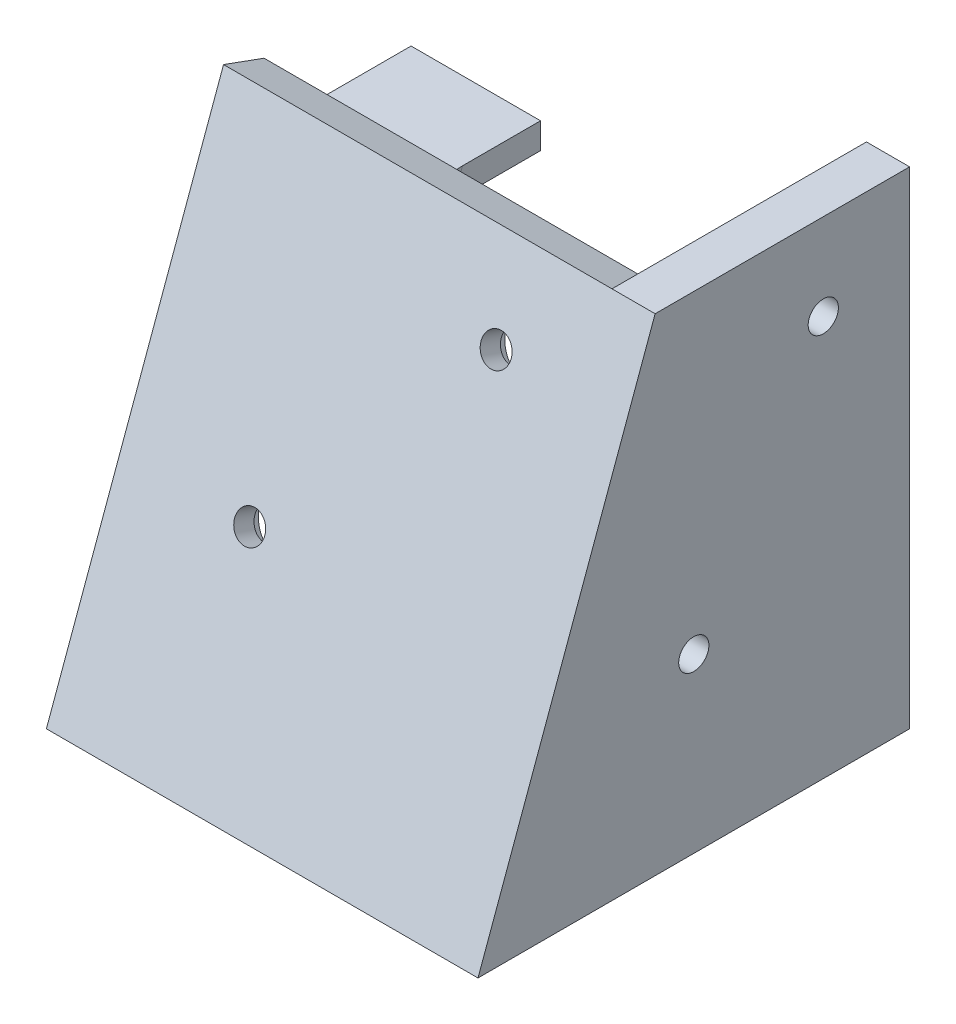
ISO-10303-21;
HEADER;
FILE_DESCRIPTION(('STEP AP214'),'2;1');
FILE_NAME('part.step','',(''),(''),'','','');
FILE_SCHEMA(('AUTOMOTIVE_DESIGN { 1 0 10303 214 1 1 1 1 }'));
ENDSEC;
DATA;
#1=APPLICATION_CONTEXT('core data for automotive mechanical design processes');
#2=APPLICATION_PROTOCOL_DEFINITION('international standard','automotive_design',2000,#1);
#3=PRODUCT_CONTEXT('',#1,'mechanical');
#4=PRODUCT('Part','Part','',(#3));
#5=PRODUCT_RELATED_PRODUCT_CATEGORY('part','',(#4));
#6=PRODUCT_DEFINITION_FORMATION('','',#4);
#7=PRODUCT_DEFINITION_CONTEXT('part definition',#1,'design');
#8=PRODUCT_DEFINITION('design','',#6,#7);
#9=PRODUCT_DEFINITION_SHAPE('','',#8);
#10=(LENGTH_UNIT() NAMED_UNIT(*) SI_UNIT(.MILLI.,.METRE.));
#11=(NAMED_UNIT(*) PLANE_ANGLE_UNIT() SI_UNIT($,.RADIAN.));
#12=(NAMED_UNIT(*) SI_UNIT($,.STERADIAN.) SOLID_ANGLE_UNIT());
#13=UNCERTAINTY_MEASURE_WITH_UNIT(LENGTH_MEASURE(1.E-05),#10,'distance_accuracy_value','');
#14=(GEOMETRIC_REPRESENTATION_CONTEXT(3) GLOBAL_UNCERTAINTY_ASSIGNED_CONTEXT((#13)) GLOBAL_UNIT_ASSIGNED_CONTEXT((#10,
#11,#12)) REPRESENTATION_CONTEXT('',''));
#15=CARTESIAN_POINT('',(0.,0.,0.));
#16=DIRECTION('',(0.,0.,1.));
#17=DIRECTION('',(1.,0.,0.));
#18=AXIS2_PLACEMENT_3D('',#15,#16,#17);
#19=CARTESIAN_POINT('',(25.,54.6714565305261,24.7803282965301));
#20=DIRECTION('',(0.,0.342020143325673,0.939692620785907));
#21=DIRECTION('',(0.,-0.939692620785907,0.342020143325673));
#22=AXIS2_PLACEMENT_3D('',#19,#20,#21);
#23=PLANE('',#22);
#24=CARTESIAN_POINT('',(10.,45.274530322667,28.2005297297869));
#25=DIRECTION('',(0.,-0.342020143325673,-0.939692620785907));
#26=DIRECTION('',(0.,0.939692620785907,-0.342020143325673));
#27=AXIS2_PLACEMENT_3D('',#24,#25,#26);
#28=CIRCLE('',#27,3.49999999999999);
#29=CARTESIAN_POINT('',(10.,48.5634544954177,27.003459228147));
#30=VERTEX_POINT('',#29);
#31=EDGE_CURVE('E207',#30,#30,#28,.T.);
#32=ORIENTED_EDGE('',*,*,#31,.F.);
#33=EDGE_LOOP('',(#32));
#34=FACE_BOUND('',#33,.T.);
#35=DIRECTION('',(0.,0.939692620785907,-0.342020143325673));
#36=VECTOR('',#35,1.);
#37=CARTESIAN_POINT('',(0.,54.6714565305261,24.7803282965301));
#38=LINE('',#37,#36);
#39=CARTESIAN_POINT('',(0.,44.3815572471544,28.5255453492746));
#40=VERTEX_POINT('',#39);
#41=CARTESIAN_POINT('',(0.,47.3815572471544,27.433634646476));
#42=VERTEX_POINT('',#41);
#43=EDGE_CURVE('E332',#40,#42,#38,.T.);
#44=ORIENTED_EDGE('',*,*,#43,.T.);
#45=DIRECTION('',(1.,0.,0.));
#46=VECTOR('',#45,1.);
#47=CARTESIAN_POINT('',(25.,47.3815572471544,27.433634646476));
#48=LINE('',#47,#46);
#49=CARTESIAN_POINT('',(-25.,47.3815572471544,27.433634646476));
#50=VERTEX_POINT('',#49);
#51=EDGE_CURVE('E188',#50,#42,#48,.T.);
#52=ORIENTED_EDGE('',*,*,#51,.F.);
#53=DIRECTION('',(0.,0.939692620785907,-0.342020143325673));
#54=VECTOR('',#53,1.);
#55=CARTESIAN_POINT('',(-25.,54.6714565305261,24.7803282965301));
#56=LINE('',#55,#54);
#57=CARTESIAN_POINT('',(-25.,54.6714565305261,24.7803282965301));
#58=VERTEX_POINT('',#57);
#59=EDGE_CURVE('E307',#50,#58,#56,.T.);
#60=ORIENTED_EDGE('',*,*,#59,.T.);
#61=DIRECTION('',(-1.,0.,0.));
#62=VECTOR('',#61,1.);
#63=CARTESIAN_POINT('',(25.,54.6714565305261,24.7803282965301));
#64=LINE('',#63,#62);
#65=CARTESIAN_POINT('',(20.,54.6714565305261,24.7803282965301));
#66=VERTEX_POINT('',#65);
#67=EDGE_CURVE('E326',#66,#58,#64,.T.);
#68=ORIENTED_EDGE('',*,*,#67,.F.);
#69=DIRECTION('',(0.,0.939692620785907,-0.342020143325673));
#70=VECTOR('',#69,1.);
#71=CARTESIAN_POINT('',(20.,-1.71074350423805,45.3017708516274));
#72=LINE('',#71,#70);
#73=CARTESIAN_POINT('',(20.,5.,42.8592599662894));
#74=VERTEX_POINT('',#73);
#75=EDGE_CURVE('E292',#74,#66,#72,.T.);
#76=ORIENTED_EDGE('',*,*,#75,.F.);
#77=DIRECTION('',(-1.,0.,0.));
#78=VECTOR('',#77,1.);
#79=CARTESIAN_POINT('',(25.,5.,42.8592599662894));
#80=LINE('',#79,#78);
#81=CARTESIAN_POINT('',(-25.,5.,42.8592599662894));
#82=VERTEX_POINT('',#81);
#83=EDGE_CURVE('E329',#74,#82,#80,.T.);
#84=ORIENTED_EDGE('',*,*,#83,.T.);
#85=CARTESIAN_POINT('',(-25.,44.3815572471544,28.5255453492746));
#86=VERTEX_POINT('',#85);
#87=EDGE_CURVE('E308',#82,#86,#56,.T.);
#88=ORIENTED_EDGE('',*,*,#87,.T.);
#89=DIRECTION('',(1.,0.,0.));
#90=VECTOR('',#89,1.);
#91=CARTESIAN_POINT('',(25.,44.3815572471544,28.5255453492746));
#92=LINE('',#91,#90);
#93=EDGE_CURVE('E191',#86,#40,#92,.T.);
#94=ORIENTED_EDGE('',*,*,#93,.T.);
#95=EDGE_LOOP('',(#44,#52,#60,#68,#76,#84,#88,#94));
#96=FACE_BOUND('',#95,.T.);
#97=CARTESIAN_POINT('',(-10.,21.7822148030193,36.7510333129287));
#98=DIRECTION('',(0.,-0.342020143325673,-0.939692620785907));
#99=DIRECTION('',(0.,0.939692620785907,-0.342020143325673));
#100=AXIS2_PLACEMENT_3D('',#97,#98,#99);
#101=CIRCLE('',#100,3.49999999999999);
#102=CARTESIAN_POINT('',(-10.,25.07113897577,35.5539628112888));
#103=VERTEX_POINT('',#102);
#104=EDGE_CURVE('E214',#103,#103,#101,.T.);
#105=ORIENTED_EDGE('',*,*,#104,.F.);
#106=EDGE_LOOP('',(#105));
#107=FACE_BOUND('',#106,.T.);
#108=ADVANCED_FACE('F49',(#34,#96,#107),#23,.F.);
#109=CARTESIAN_POINT('',(25.,5.,42.8592599662894));
#110=DIRECTION('',(0.,-1.,0.));
#111=DIRECTION('',(0.,0.,-1.));
#112=AXIS2_PLACEMENT_3D('',#109,#110,#111);
#113=PLANE('',#112);
#114=DIRECTION('',(0.,0.,-1.));
#115=VECTOR('',#114,1.);
#116=CARTESIAN_POINT('',(8.36220000000001,5.,27.3621999892985));
#117=LINE('',#116,#115);
#118=CARTESIAN_POINT('',(8.36220000000001,5.,27.3621999892985));
#119=VERTEX_POINT('',#118);
#120=CARTESIAN_POINT('',(8.3622,5.,5.));
#121=VERTEX_POINT('',#120);
#122=EDGE_CURVE('E235',#119,#121,#117,.T.);
#123=ORIENTED_EDGE('',*,*,#122,.F.);
#124=DIRECTION('',(1.,0.,0.));
#125=VECTOR('',#124,1.);
#126=CARTESIAN_POINT('',(8.36220000000001,5.,27.3621999892985));
#127=LINE('',#126,#125);
#128=CARTESIAN_POINT('',(-25.,5.,27.3621999892985));
#129=VERTEX_POINT('',#128);
#130=EDGE_CURVE('E237',#129,#119,#127,.T.);
#131=ORIENTED_EDGE('',*,*,#130,.F.);
#132=DIRECTION('',(0.,0.,1.));
#133=VECTOR('',#132,1.);
#134=CARTESIAN_POINT('',(-25.,5.,42.8592599662894));
#135=LINE('',#134,#133);
#136=EDGE_CURVE('E297',#129,#82,#135,.T.);
#137=ORIENTED_EDGE('',*,*,#136,.T.);
#138=ORIENTED_EDGE('',*,*,#83,.F.);
#139=DIRECTION('',(0.,0.,1.));
#140=VECTOR('',#139,1.);
#141=CARTESIAN_POINT('',(20.,5.,50.002));
#142=LINE('',#141,#140);
#143=CARTESIAN_POINT('',(20.,5.,5.));
#144=VERTEX_POINT('',#143);
#145=EDGE_CURVE('E291',#144,#74,#142,.T.);
#146=ORIENTED_EDGE('',*,*,#145,.F.);
#147=DIRECTION('',(1.,0.,0.));
#148=VECTOR('',#147,1.);
#149=CARTESIAN_POINT('',(-25.,5.,5.));
#150=LINE('',#149,#148);
#151=EDGE_CURVE('E254',#121,#144,#150,.T.);
#152=ORIENTED_EDGE('',*,*,#151,.F.);
#153=EDGE_LOOP('',(#123,#131,#137,#138,#146,#152));
#154=FACE_BOUND('',#153,.T.);
#155=CARTESIAN_POINT('',(10.,5.,32.6992599662894));
#156=DIRECTION('',(0.,1.,0.));
#157=DIRECTION('',(0.,0.,1.));
#158=AXIS2_PLACEMENT_3D('',#155,#156,#157);
#159=CIRCLE('',#158,3.49999999999999);
#160=CARTESIAN_POINT('',(10.,5.,36.1992599662894));
#161=VERTEX_POINT('',#160);
#162=EDGE_CURVE('E228',#161,#161,#159,.T.);
#163=ORIENTED_EDGE('',*,*,#162,.F.);
#164=EDGE_LOOP('',(#163));
#165=FACE_BOUND('',#164,.T.);
#166=CARTESIAN_POINT('',(-10.,5.,32.6992599662894));
#167=DIRECTION('',(0.,1.,0.));
#168=DIRECTION('',(0.,0.,1.));
#169=AXIS2_PLACEMENT_3D('',#166,#167,#168);
#170=CIRCLE('',#169,3.49999999999999);
#171=CARTESIAN_POINT('',(-10.,5.,36.1992599662894));
#172=VERTEX_POINT('',#171);
#173=EDGE_CURVE('E221',#172,#172,#170,.T.);
#174=ORIENTED_EDGE('',*,*,#173,.F.);
#175=EDGE_LOOP('',(#174));
#176=FACE_BOUND('',#175,.T.);
#177=ADVANCED_FACE('F404',(#154,#165,#176),#113,.F.);
#178=CARTESIAN_POINT('',(25.,5.,0.));
#179=DIRECTION('',(0.,0.,1.));
#180=DIRECTION('',(0.,-1.,0.));
#181=AXIS2_PLACEMENT_3D('',#178,#179,#180);
#182=PLANE('',#181);
#183=DIRECTION('',(-1.,0.,0.));
#184=VECTOR('',#183,1.);
#185=CARTESIAN_POINT('',(25.,0.,0.));
#186=LINE('',#185,#184);
#187=CARTESIAN_POINT('',(25.,0.,0.));
#188=VERTEX_POINT('',#187);
#189=CARTESIAN_POINT('',(20.,0.,0.));
#190=VERTEX_POINT('',#189);
#191=EDGE_CURVE('E305',#188,#190,#186,.T.);
#192=ORIENTED_EDGE('',*,*,#191,.T.);
#193=DIRECTION('',(0.,1.,0.));
#194=VECTOR('',#193,1.);
#195=CARTESIAN_POINT('',(20.,0.,0.));
#196=LINE('',#195,#194);
#197=CARTESIAN_POINT('',(20.,56.3815572471544,0.));
#198=VERTEX_POINT('',#197);
#199=EDGE_CURVE('E281',#190,#198,#196,.T.);
#200=ORIENTED_EDGE('',*,*,#199,.T.);
#201=DIRECTION('',(1.,0.,0.));
#202=VECTOR('',#201,1.);
#203=CARTESIAN_POINT('',(25.,56.3815572471544,0.));
#204=LINE('',#203,#202);
#205=CARTESIAN_POINT('',(25.,56.3815572471544,0.));
#206=VERTEX_POINT('',#205);
#207=EDGE_CURVE('E280',#198,#206,#204,.T.);
#208=ORIENTED_EDGE('',*,*,#207,.T.);
#209=DIRECTION('',(0.,1.,0.));
#210=VECTOR('',#209,1.);
#211=CARTESIAN_POINT('',(25.,5.,0.));
#212=LINE('',#211,#210);
#213=EDGE_CURVE('E298',#188,#206,#212,.T.);
#214=ORIENTED_EDGE('',*,*,#213,.F.);
#215=EDGE_LOOP('',(#192,#200,#208,#214));
#216=FACE_BOUND('',#215,.T.);
#217=ADVANCED_FACE('F387',(#216),#182,.F.);
#218=CARTESIAN_POINT('',(25.,56.3815572471544,29.4787914004597));
#219=DIRECTION('',(0.,-0.939692620785908,0.342020143325671));
#220=DIRECTION('',(0.,-0.342020143325671,-0.939692620785908));
#221=AXIS2_PLACEMENT_3D('',#218,#219,#220);
#222=PLANE('',#221);
#223=DIRECTION('',(-1.,0.,0.));
#224=VECTOR('',#223,1.);
#225=CARTESIAN_POINT('',(25.,56.3815572471544,29.4787914004597));
#226=LINE('',#225,#224);
#227=CARTESIAN_POINT('',(20.,56.3815572471544,29.4787914004597));
#228=VERTEX_POINT('',#227);
#229=CARTESIAN_POINT('',(-25.,56.3815572471544,29.4787914004597));
#230=VERTEX_POINT('',#229);
#231=EDGE_CURVE('E322',#228,#230,#226,.T.);
#232=ORIENTED_EDGE('',*,*,#231,.F.);
#233=DIRECTION('',(0.,0.342020143325671,0.939692620785908));
#234=VECTOR('',#233,1.);
#235=CARTESIAN_POINT('',(20.,56.3822000347642,29.4805574449029));
#236=LINE('',#235,#234);
#237=EDGE_CURVE('E294',#66,#228,#236,.T.);
#238=ORIENTED_EDGE('',*,*,#237,.F.);
#239=ORIENTED_EDGE('',*,*,#67,.T.);
#240=DIRECTION('',(0.,0.342020143325671,0.939692620785908));
#241=VECTOR('',#240,1.);
#242=CARTESIAN_POINT('',(-25.,56.3815572471544,29.4787914004597));
#243=LINE('',#242,#241);
#244=EDGE_CURVE('E310',#58,#230,#243,.T.);
#245=ORIENTED_EDGE('',*,*,#244,.T.);
#246=EDGE_LOOP('',(#232,#238,#239,#245));
#247=FACE_BOUND('',#246,.T.);
#248=ADVANCED_FACE('F377',(#247),#222,.F.);
#249=CARTESIAN_POINT('',(25.,0.,50.));
#250=DIRECTION('',(0.,-0.342020143325672,-0.939692620785907));
#251=DIRECTION('',(0.,0.939692620785907,-0.342020143325672));
#252=AXIS2_PLACEMENT_3D('',#249,#250,#251);
#253=PLANE('',#252);
#254=DIRECTION('',(0.,-0.939692620785907,0.342020143325672));
#255=VECTOR('',#254,1.);
#256=CARTESIAN_POINT('',(-25.,0.,50.));
#257=LINE('',#256,#255);
#258=CARTESIAN_POINT('',(-25.,0.,50.));
#259=VERTEX_POINT('',#258);
#260=EDGE_CURVE('E313',#230,#259,#257,.T.);
#261=ORIENTED_EDGE('',*,*,#260,.T.);
#262=DIRECTION('',(-1.,0.,0.));
#263=VECTOR('',#262,1.);
#264=CARTESIAN_POINT('',(25.,0.,50.));
#265=LINE('',#264,#263);
#266=CARTESIAN_POINT('',(25.,0.,50.));
#267=VERTEX_POINT('',#266);
#268=EDGE_CURVE('E319',#267,#259,#265,.T.);
#269=ORIENTED_EDGE('',*,*,#268,.F.);
#270=DIRECTION('',(0.,-0.939692620785907,0.342020143325672));
#271=VECTOR('',#270,1.);
#272=CARTESIAN_POINT('',(25.,0.,50.));
#273=LINE('',#272,#271);
#274=CARTESIAN_POINT('',(25.,56.3815572471544,29.4787914004597));
#275=VERTEX_POINT('',#274);
#276=EDGE_CURVE('E300',#275,#267,#273,.T.);
#277=ORIENTED_EDGE('',*,*,#276,.F.);
#278=EDGE_CURVE('E323',#275,#228,#226,.T.);
#279=ORIENTED_EDGE('',*,*,#278,.T.);
#280=ORIENTED_EDGE('',*,*,#231,.T.);
#281=EDGE_LOOP('',(#261,#269,#277,#279,#280));
#282=FACE_BOUND('',#281,.T.);
#283=CARTESIAN_POINT('',(10.,46.9846310392954,32.8989928337164));
#284=DIRECTION('',(0.,0.342020143325672,0.939692620785907));
#285=DIRECTION('',(0.,-0.939692620785907,0.342020143325672));
#286=AXIS2_PLACEMENT_3D('',#283,#284,#285);
#287=CIRCLE('',#286,1.75);
#288=CARTESIAN_POINT('',(10.,45.34016895292,33.4975280845363));
#289=VERTEX_POINT('',#288);
#290=EDGE_CURVE('E262',#289,#289,#287,.T.);
#291=ORIENTED_EDGE('',*,*,#290,.F.);
#292=EDGE_LOOP('',(#291));
#293=FACE_BOUND('',#292,.T.);
#294=CARTESIAN_POINT('',(-10.,23.4923155196477,41.4494964168582));
#295=DIRECTION('',(0.,0.342020143325672,0.939692620785907));
#296=DIRECTION('',(0.,-0.939692620785907,0.342020143325672));
#297=AXIS2_PLACEMENT_3D('',#294,#295,#296);
#298=CIRCLE('',#297,1.75);
#299=CARTESIAN_POINT('',(-10.,21.8478534332723,42.0480316676781));
#300=VERTEX_POINT('',#299);
#301=EDGE_CURVE('E265',#300,#300,#298,.T.);
#302=ORIENTED_EDGE('',*,*,#301,.F.);
#303=EDGE_LOOP('',(#302));
#304=FACE_BOUND('',#303,.T.);
#305=ADVANCED_FACE('F411',(#282,#293,#304),#253,.F.);
#306=CARTESIAN_POINT('',(25.,0.,0.));
#307=DIRECTION('',(0.,1.,0.));
#308=DIRECTION('',(0.,0.,1.));
#309=AXIS2_PLACEMENT_3D('',#306,#307,#308);
#310=PLANE('',#309);
#311=CARTESIAN_POINT('',(10.,0.,32.6992599662894));
#312=DIRECTION('',(0.,1.,0.));
#313=DIRECTION('',(0.,0.,1.));
#314=AXIS2_PLACEMENT_3D('',#311,#312,#313);
#315=CIRCLE('',#314,1.75);
#316=CARTESIAN_POINT('',(10.,0.,34.4492599662894));
#317=VERTEX_POINT('',#316);
#318=EDGE_CURVE('E274',#317,#317,#315,.T.);
#319=ORIENTED_EDGE('',*,*,#318,.T.);
#320=EDGE_LOOP('',(#319));
#321=FACE_BOUND('',#320,.T.);
#322=CARTESIAN_POINT('',(-10.,0.,32.6992599662894));
#323=DIRECTION('',(0.,1.,0.));
#324=DIRECTION('',(0.,0.,1.));
#325=AXIS2_PLACEMENT_3D('',#322,#323,#324);
#326=CIRCLE('',#325,1.75);
#327=CARTESIAN_POINT('',(-10.,0.,34.4492599662894));
#328=VERTEX_POINT('',#327);
#329=EDGE_CURVE('E277',#328,#328,#326,.T.);
#330=ORIENTED_EDGE('',*,*,#329,.T.);
#331=EDGE_LOOP('',(#330));
#332=FACE_BOUND('',#331,.T.);
#333=DIRECTION('',(0.,0.,-1.));
#334=VECTOR('',#333,1.);
#335=CARTESIAN_POINT('',(-25.,0.,0.));
#336=LINE('',#335,#334);
#337=CARTESIAN_POINT('',(-25.,0.,27.3621999892985));
#338=VERTEX_POINT('',#337);
#339=EDGE_CURVE('E301',#259,#338,#336,.T.);
#340=ORIENTED_EDGE('',*,*,#339,.T.);
#341=DIRECTION('',(-1.,0.,0.));
#342=VECTOR('',#341,1.);
#343=CARTESIAN_POINT('',(8.36220000000001,0.,27.3621999892985));
#344=LINE('',#343,#342);
#345=CARTESIAN_POINT('',(8.36220000000001,0.,27.3621999892985));
#346=VERTEX_POINT('',#345);
#347=EDGE_CURVE('E241',#346,#338,#344,.T.);
#348=ORIENTED_EDGE('',*,*,#347,.F.);
#349=DIRECTION('',(0.,0.,1.));
#350=VECTOR('',#349,1.);
#351=CARTESIAN_POINT('',(8.36220000000001,0.,27.3621999892985));
#352=LINE('',#351,#350);
#353=CARTESIAN_POINT('',(8.36220000000002,0.,5.));
#354=VERTEX_POINT('',#353);
#355=EDGE_CURVE('E243',#354,#346,#352,.T.);
#356=ORIENTED_EDGE('',*,*,#355,.F.);
#357=DIRECTION('',(-1.,0.,0.));
#358=VECTOR('',#357,1.);
#359=CARTESIAN_POINT('',(-25.,0.,5.));
#360=LINE('',#359,#358);
#361=CARTESIAN_POINT('',(20.,0.,5.));
#362=VERTEX_POINT('',#361);
#363=EDGE_CURVE('E259',#362,#354,#360,.T.);
#364=ORIENTED_EDGE('',*,*,#363,.F.);
#365=DIRECTION('',(0.,0.,1.));
#366=VECTOR('',#365,1.);
#367=CARTESIAN_POINT('',(20.,0.,0.));
#368=LINE('',#367,#366);
#369=EDGE_CURVE('E240',#190,#362,#368,.T.);
#370=ORIENTED_EDGE('',*,*,#369,.F.);
#371=ORIENTED_EDGE('',*,*,#191,.F.);
#372=DIRECTION('',(0.,0.,-1.));
#373=VECTOR('',#372,1.);
#374=CARTESIAN_POINT('',(25.,0.,0.));
#375=LINE('',#374,#373);
#376=EDGE_CURVE('E303',#267,#188,#375,.T.);
#377=ORIENTED_EDGE('',*,*,#376,.F.);
#378=ORIENTED_EDGE('',*,*,#268,.T.);
#379=EDGE_LOOP('',(#340,#348,#356,#364,#370,#371,#377,#378));
#380=FACE_BOUND('',#379,.T.);
#381=ADVANCED_FACE('F392',(#321,#332,#380),#310,.F.);
#382=CARTESIAN_POINT('',(25.,0.,0.));
#383=DIRECTION('',(-1.,0.,0.));
#384=DIRECTION('',(0.,0.,1.));
#385=AXIS2_PLACEMENT_3D('',#382,#383,#384);
#386=PLANE('',#385);
#387=CARTESIAN_POINT('',(25.,46.3815572471544,10.));
#388=DIRECTION('',(-1.,0.,0.));
#389=DIRECTION('',(0.,0.,1.));
#390=AXIS2_PLACEMENT_3D('',#387,#388,#389);
#391=CIRCLE('',#390,1.75);
#392=CARTESIAN_POINT('',(25.,46.3815572471544,11.75));
#393=VERTEX_POINT('',#392);
#394=EDGE_CURVE('E268',#393,#393,#391,.T.);
#395=ORIENTED_EDGE('',*,*,#394,.T.);
#396=EDGE_LOOP('',(#395));
#397=FACE_BOUND('',#396,.T.);
#398=CARTESIAN_POINT('',(25.,20.,25.));
#399=DIRECTION('',(-1.,0.,0.));
#400=DIRECTION('',(0.,0.,1.));
#401=AXIS2_PLACEMENT_3D('',#398,#399,#400);
#402=CIRCLE('',#401,1.75);
#403=CARTESIAN_POINT('',(25.,20.,26.75));
#404=VERTEX_POINT('',#403);
#405=EDGE_CURVE('E271',#404,#404,#402,.T.);
#406=ORIENTED_EDGE('',*,*,#405,.T.);
#407=EDGE_LOOP('',(#406));
#408=FACE_BOUND('',#407,.T.);
#409=DIRECTION('',(0.,0.,-1.));
#410=VECTOR('',#409,1.);
#411=CARTESIAN_POINT('',(25.,56.3815572471544,50.002));
#412=LINE('',#411,#410);
#413=EDGE_CURVE('E284',#275,#206,#412,.T.);
#414=ORIENTED_EDGE('',*,*,#413,.F.);
#415=ORIENTED_EDGE('',*,*,#276,.T.);
#416=ORIENTED_EDGE('',*,*,#376,.T.);
#417=ORIENTED_EDGE('',*,*,#213,.T.);
#418=EDGE_LOOP('',(#414,#415,#416,#417));
#419=FACE_BOUND('',#418,.T.);
#420=ADVANCED_FACE('F414',(#397,#408,#419),#386,.F.);
#421=CARTESIAN_POINT('',(-25.,0.,0.));
#422=DIRECTION('',(-1.,0.,0.));
#423=DIRECTION('',(0.,0.,1.));
#424=AXIS2_PLACEMENT_3D('',#421,#422,#423);
#425=PLANE('',#424);
#426=ORIENTED_EDGE('',*,*,#339,.F.);
#427=ORIENTED_EDGE('',*,*,#260,.F.);
#428=ORIENTED_EDGE('',*,*,#244,.F.);
#429=ORIENTED_EDGE('',*,*,#59,.F.);
#430=DIRECTION('',(0.,0.,1.));
#431=VECTOR('',#430,1.);
#432=CARTESIAN_POINT('',(-25.,47.3815572471544,32.7545235088555));
#433=LINE('',#432,#431);
#434=CARTESIAN_POINT('',(-25.,47.3815572471544,7.75452350885552));
#435=VERTEX_POINT('',#434);
#436=EDGE_CURVE('E181',#435,#50,#433,.T.);
#437=ORIENTED_EDGE('',*,*,#436,.F.);
#438=DIRECTION('',(0.,1.,0.));
#439=VECTOR('',#438,1.);
#440=CARTESIAN_POINT('',(-25.,44.3815572471544,7.75452350885552));
#441=LINE('',#440,#439);
#442=CARTESIAN_POINT('',(-25.,44.3815572471544,7.75452350885552));
#443=VERTEX_POINT('',#442);
#444=EDGE_CURVE('E172',#443,#435,#441,.T.);
#445=ORIENTED_EDGE('',*,*,#444,.F.);
#446=DIRECTION('',(0.,0.,1.));
#447=VECTOR('',#446,1.);
#448=CARTESIAN_POINT('',(-25.,44.3815572471544,32.7545235088555));
#449=LINE('',#448,#447);
#450=EDGE_CURVE('E165',#443,#86,#449,.T.);
#451=ORIENTED_EDGE('',*,*,#450,.T.);
#452=ORIENTED_EDGE('',*,*,#87,.F.);
#453=ORIENTED_EDGE('',*,*,#136,.F.);
#454=DIRECTION('',(0.,-1.,0.));
#455=VECTOR('',#454,1.);
#456=CARTESIAN_POINT('',(-25.,45.16347068172,27.3621999892985));
#457=LINE('',#456,#455);
#458=EDGE_CURVE('E246',#129,#338,#457,.T.);
#459=ORIENTED_EDGE('',*,*,#458,.T.);
#460=EDGE_LOOP('',(#426,#427,#428,#429,#437,#445,#451,#452,#453,#459));
#461=FACE_BOUND('',#460,.T.);
#462=ADVANCED_FACE('F355',(#461),#425,.T.);
#463=CARTESIAN_POINT('',(25.,56.3815572471544,50.002));
#464=DIRECTION('',(0.,1.,0.));
#465=DIRECTION('',(0.,0.,1.));
#466=AXIS2_PLACEMENT_3D('',#463,#464,#465);
#467=PLANE('',#466);
#468=DIRECTION('',(0.,0.,-1.));
#469=VECTOR('',#468,1.);
#470=CARTESIAN_POINT('',(20.,56.3815572471544,50.002));
#471=LINE('',#470,#469);
#472=EDGE_CURVE('E289',#228,#198,#471,.T.);
#473=ORIENTED_EDGE('',*,*,#472,.F.);
#474=ORIENTED_EDGE('',*,*,#278,.F.);
#475=ORIENTED_EDGE('',*,*,#413,.T.);
#476=ORIENTED_EDGE('',*,*,#207,.F.);
#477=EDGE_LOOP('',(#473,#474,#475,#476));
#478=FACE_BOUND('',#477,.T.);
#479=ADVANCED_FACE('F383',(#478),#467,.T.);
#480=CARTESIAN_POINT('',(20.,0.,50.002));
#481=DIRECTION('',(-1.,0.,0.));
#482=DIRECTION('',(0.,0.,1.));
#483=AXIS2_PLACEMENT_3D('',#480,#481,#482);
#484=PLANE('',#483);
#485=CARTESIAN_POINT('',(20.,46.3815572471544,10.));
#486=DIRECTION('',(-1.,0.,0.));
#487=DIRECTION('',(0.,0.,1.));
#488=AXIS2_PLACEMENT_3D('',#485,#486,#487);
#489=CIRCLE('',#488,3.49999999999999);
#490=CARTESIAN_POINT('',(20.,46.3815572471544,13.5));
#491=VERTEX_POINT('',#490);
#492=EDGE_CURVE('E193',#491,#491,#489,.T.);
#493=ORIENTED_EDGE('',*,*,#492,.F.);
#494=EDGE_LOOP('',(#493));
#495=FACE_BOUND('',#494,.T.);
#496=CARTESIAN_POINT('',(20.,20.,25.));
#497=DIRECTION('',(-1.,0.,0.));
#498=DIRECTION('',(0.,0.,1.));
#499=AXIS2_PLACEMENT_3D('',#496,#497,#498);
#500=CIRCLE('',#499,3.49999999999999);
#501=CARTESIAN_POINT('',(20.,20.,28.5));
#502=VERTEX_POINT('',#501);
#503=EDGE_CURVE('E200',#502,#502,#500,.T.);
#504=ORIENTED_EDGE('',*,*,#503,.F.);
#505=EDGE_LOOP('',(#504));
#506=FACE_BOUND('',#505,.T.);
#507=ORIENTED_EDGE('',*,*,#75,.T.);
#508=ORIENTED_EDGE('',*,*,#237,.T.);
#509=ORIENTED_EDGE('',*,*,#472,.T.);
#510=ORIENTED_EDGE('',*,*,#199,.F.);
#511=ORIENTED_EDGE('',*,*,#369,.T.);
#512=DIRECTION('',(0.,1.,0.));
#513=VECTOR('',#512,1.);
#514=CARTESIAN_POINT('',(20.,-0.0010000000000062,5.));
#515=LINE('',#514,#513);
#516=EDGE_CURVE('E256',#362,#144,#515,.T.);
#517=ORIENTED_EDGE('',*,*,#516,.T.);
#518=ORIENTED_EDGE('',*,*,#145,.T.);
#519=EDGE_LOOP('',(#507,#508,#509,#510,#511,#517,#518));
#520=FACE_BOUND('',#519,.T.);
#521=ADVANCED_FACE('F380',(#495,#506,#520),#484,.T.);
#522=CARTESIAN_POINT('',(-10.,5.,32.6992599662894));
#523=DIRECTION('',(0.,1.,0.));
#524=DIRECTION('',(0.,0.,1.));
#525=AXIS2_PLACEMENT_3D('',#522,#523,#524);
#526=CYLINDRICAL_SURFACE('',#525,1.75);
#527=CARTESIAN_POINT('',(-10.,2.5,32.6992599662894));
#528=DIRECTION('',(0.,-1.,0.));
#529=DIRECTION('',(0.,0.,-1.));
#530=AXIS2_PLACEMENT_3D('',#527,#528,#529);
#531=CIRCLE('',#530,1.75);
#532=CARTESIAN_POINT('',(-10.,2.5,30.9492599662894));
#533=VERTEX_POINT('',#532);
#534=EDGE_CURVE('E227',#533,#533,#531,.F.);
#535=ORIENTED_EDGE('',*,*,#534,.T.);
#536=EDGE_LOOP('',(#535));
#537=FACE_BOUND('',#536,.T.);
#538=ORIENTED_EDGE('',*,*,#329,.F.);
#539=EDGE_LOOP('',(#538));
#540=FACE_BOUND('',#539,.T.);
#541=ADVANCED_FACE('F580',(#537,#540),#526,.F.);
#542=CARTESIAN_POINT('',(10.,5.,32.6992599662894));
#543=DIRECTION('',(0.,1.,0.));
#544=DIRECTION('',(0.,0.,1.));
#545=AXIS2_PLACEMENT_3D('',#542,#543,#544);
#546=CYLINDRICAL_SURFACE('',#545,1.75);
#547=CARTESIAN_POINT('',(10.,2.5,32.6992599662894));
#548=DIRECTION('',(0.,-1.,0.));
#549=DIRECTION('',(0.,0.,-1.));
#550=AXIS2_PLACEMENT_3D('',#547,#548,#549);
#551=CIRCLE('',#550,1.75);
#552=CARTESIAN_POINT('',(10.,2.5,30.9492599662894));
#553=VERTEX_POINT('',#552);
#554=EDGE_CURVE('E234',#553,#553,#551,.F.);
#555=ORIENTED_EDGE('',*,*,#554,.T.);
#556=EDGE_LOOP('',(#555));
#557=FACE_BOUND('',#556,.T.);
#558=ORIENTED_EDGE('',*,*,#318,.F.);
#559=EDGE_LOOP('',(#558));
#560=FACE_BOUND('',#559,.T.);
#561=ADVANCED_FACE('F576',(#557,#560),#546,.F.);
#562=CARTESIAN_POINT('',(20.,20.,25.));
#563=DIRECTION('',(-1.,0.,0.));
#564=DIRECTION('',(0.,0.,1.));
#565=AXIS2_PLACEMENT_3D('',#562,#563,#564);
#566=CYLINDRICAL_SURFACE('',#565,1.75);
#567=CARTESIAN_POINT('',(22.5,20.,25.));
#568=DIRECTION('',(1.,0.,0.));
#569=DIRECTION('',(0.,0.,-1.));
#570=AXIS2_PLACEMENT_3D('',#567,#568,#569);
#571=CIRCLE('',#570,1.75);
#572=CARTESIAN_POINT('',(22.5,20.,23.25));
#573=VERTEX_POINT('',#572);
#574=EDGE_CURVE('E206',#573,#573,#571,.F.);
#575=ORIENTED_EDGE('',*,*,#574,.T.);
#576=EDGE_LOOP('',(#575));
#577=FACE_BOUND('',#576,.T.);
#578=ORIENTED_EDGE('',*,*,#405,.F.);
#579=EDGE_LOOP('',(#578));
#580=FACE_BOUND('',#579,.T.);
#581=ADVANCED_FACE('F572',(#577,#580),#566,.F.);
#582=CARTESIAN_POINT('',(20.,46.3815572471544,10.));
#583=DIRECTION('',(-1.,0.,0.));
#584=DIRECTION('',(0.,0.,1.));
#585=AXIS2_PLACEMENT_3D('',#582,#583,#584);
#586=CYLINDRICAL_SURFACE('',#585,1.75);
#587=CARTESIAN_POINT('',(22.5,46.3815572471544,10.));
#588=DIRECTION('',(1.,0.,0.));
#589=DIRECTION('',(0.,0.,-1.));
#590=AXIS2_PLACEMENT_3D('',#587,#588,#589);
#591=CIRCLE('',#590,1.75);
#592=CARTESIAN_POINT('',(22.5,46.3815572471544,8.25));
#593=VERTEX_POINT('',#592);
#594=EDGE_CURVE('E199',#593,#593,#591,.F.);
#595=ORIENTED_EDGE('',*,*,#594,.T.);
#596=EDGE_LOOP('',(#595));
#597=FACE_BOUND('',#596,.T.);
#598=ORIENTED_EDGE('',*,*,#394,.F.);
#599=EDGE_LOOP('',(#598));
#600=FACE_BOUND('',#599,.T.);
#601=ADVANCED_FACE('F568',(#597,#600),#586,.F.);
#602=CARTESIAN_POINT('',(-10.,23.4923155196477,41.4494964168582));
#603=DIRECTION('',(0.,0.342020143325672,0.939692620785907));
#604=DIRECTION('',(0.,-0.939692620785907,0.342020143325672));
#605=AXIS2_PLACEMENT_3D('',#602,#603,#604);
#606=CYLINDRICAL_SURFACE('',#605,1.75);
#607=CARTESIAN_POINT('',(-10.,22.6372651613335,39.1002648648935));
#608=DIRECTION('',(0.,0.342020143325673,0.939692620785907));
#609=DIRECTION('',(0.,-0.939692620785907,0.342020143325673));
#610=AXIS2_PLACEMENT_3D('',#607,#608,#609);
#611=CIRCLE('',#610,1.75);
#612=CARTESIAN_POINT('',(-10.,20.9928030749582,39.6988001157134));
#613=VERTEX_POINT('',#612);
#614=EDGE_CURVE('E220',#613,#613,#611,.F.);
#615=ORIENTED_EDGE('',*,*,#614,.T.);
#616=EDGE_LOOP('',(#615));
#617=FACE_BOUND('',#616,.T.);
#618=ORIENTED_EDGE('',*,*,#301,.T.);
#619=EDGE_LOOP('',(#618));
#620=FACE_BOUND('',#619,.T.);
#621=ADVANCED_FACE('F564',(#617,#620),#606,.F.);
#622=CARTESIAN_POINT('',(10.,46.9846310392954,32.8989928337164));
#623=DIRECTION('',(0.,0.342020143325672,0.939692620785907));
#624=DIRECTION('',(0.,-0.939692620785907,0.342020143325672));
#625=AXIS2_PLACEMENT_3D('',#622,#623,#624);
#626=CYLINDRICAL_SURFACE('',#625,1.75);
#627=CARTESIAN_POINT('',(10.,46.1295806809812,30.5497612817516));
#628=DIRECTION('',(0.,0.342020143325673,0.939692620785907));
#629=DIRECTION('',(0.,-0.939692620785907,0.342020143325673));
#630=AXIS2_PLACEMENT_3D('',#627,#628,#629);
#631=CIRCLE('',#630,1.75);
#632=CARTESIAN_POINT('',(10.,44.4851185946058,31.1482965325716));
#633=VERTEX_POINT('',#632);
#634=EDGE_CURVE('E213',#633,#633,#631,.F.);
#635=ORIENTED_EDGE('',*,*,#634,.T.);
#636=EDGE_LOOP('',(#635));
#637=FACE_BOUND('',#636,.T.);
#638=ORIENTED_EDGE('',*,*,#290,.T.);
#639=EDGE_LOOP('',(#638));
#640=FACE_BOUND('',#639,.T.);
#641=ADVANCED_FACE('F561',(#637,#640),#626,.F.);
#642=CARTESIAN_POINT('',(-25.,-0.0010000000000062,5.));
#643=DIRECTION('',(0.,0.,1.));
#644=DIRECTION('',(1.,0.,0.));
#645=AXIS2_PLACEMENT_3D('',#642,#643,#644);
#646=PLANE('',#645);
#647=ORIENTED_EDGE('',*,*,#363,.T.);
#648=DIRECTION('',(0.,-1.,0.));
#649=VECTOR('',#648,1.);
#650=CARTESIAN_POINT('',(8.36220000000002,45.16347068172,5.00000000000001));
#651=LINE('',#650,#649);
#652=EDGE_CURVE('E248',#121,#354,#651,.T.);
#653=ORIENTED_EDGE('',*,*,#652,.F.);
#654=ORIENTED_EDGE('',*,*,#151,.T.);
#655=ORIENTED_EDGE('',*,*,#516,.F.);
#656=EDGE_LOOP('',(#647,#653,#654,#655));
#657=FACE_BOUND('',#656,.T.);
#658=ADVANCED_FACE('F398',(#657),#646,.F.);
#659=CARTESIAN_POINT('',(8.36220000000001,45.16347068172,27.3621999892985));
#660=DIRECTION('',(0.,0.,1.));
#661=DIRECTION('',(0.,-1.,0.));
#662=AXIS2_PLACEMENT_3D('',#659,#660,#661);
#663=PLANE('',#662);
#664=ORIENTED_EDGE('',*,*,#130,.T.);
#665=DIRECTION('',(0.,-1.,0.));
#666=VECTOR('',#665,1.);
#667=CARTESIAN_POINT('',(8.36220000000001,45.16347068172,27.3621999892985));
#668=LINE('',#667,#666);
#669=EDGE_CURVE('E238',#119,#346,#668,.T.);
#670=ORIENTED_EDGE('',*,*,#669,.T.);
#671=ORIENTED_EDGE('',*,*,#347,.T.);
#672=ORIENTED_EDGE('',*,*,#458,.F.);
#673=EDGE_LOOP('',(#664,#670,#671,#672));
#674=FACE_BOUND('',#673,.T.);
#675=ADVANCED_FACE('F555',(#674),#663,.F.);
#676=CARTESIAN_POINT('',(8.36220000000001,45.16347068172,27.3621999892985));
#677=DIRECTION('',(1.,0.,0.));
#678=DIRECTION('',(0.,0.,-1.));
#679=AXIS2_PLACEMENT_3D('',#676,#677,#678);
#680=PLANE('',#679);
#681=ORIENTED_EDGE('',*,*,#122,.T.);
#682=ORIENTED_EDGE('',*,*,#652,.T.);
#683=ORIENTED_EDGE('',*,*,#355,.T.);
#684=ORIENTED_EDGE('',*,*,#669,.F.);
#685=EDGE_LOOP('',(#681,#682,#683,#684));
#686=FACE_BOUND('',#685,.T.);
#687=ADVANCED_FACE('F551',(#686),#680,.F.);
#688=CARTESIAN_POINT('',(10.,2.5,32.6992599662894));
#689=DIRECTION('',(0.,-1.,0.));
#690=DIRECTION('',(0.,0.,-1.));
#691=AXIS2_PLACEMENT_3D('',#688,#689,#690);
#692=PLANE('',#691);
#693=CARTESIAN_POINT('',(10.,2.5,32.6992599662894));
#694=DIRECTION('',(0.,1.,0.));
#695=DIRECTION('',(0.,0.,1.));
#696=AXIS2_PLACEMENT_3D('',#693,#694,#695);
#697=CIRCLE('',#696,3.49999999999999);
#698=CARTESIAN_POINT('',(10.,2.5,36.1992599662894));
#699=VERTEX_POINT('',#698);
#700=EDGE_CURVE('E231',#699,#699,#697,.T.);
#701=ORIENTED_EDGE('',*,*,#700,.T.);
#702=EDGE_LOOP('',(#701));
#703=FACE_BOUND('',#702,.T.);
#704=ORIENTED_EDGE('',*,*,#554,.F.);
#705=EDGE_LOOP('',(#704));
#706=FACE_BOUND('',#705,.T.);
#707=ADVANCED_FACE('F547',(#703,#706),#692,.F.);
#708=CARTESIAN_POINT('',(10.,5.,32.6992599662894));
#709=DIRECTION('',(0.,1.,0.));
#710=DIRECTION('',(0.,0.,1.));
#711=AXIS2_PLACEMENT_3D('',#708,#709,#710);
#712=CYLINDRICAL_SURFACE('',#711,3.49999999999999);
#713=ORIENTED_EDGE('',*,*,#700,.F.);
#714=EDGE_LOOP('',(#713));
#715=FACE_BOUND('',#714,.T.);
#716=ORIENTED_EDGE('',*,*,#162,.T.);
#717=EDGE_LOOP('',(#716));
#718=FACE_BOUND('',#717,.T.);
#719=ADVANCED_FACE('F543',(#715,#718),#712,.F.);
#720=CARTESIAN_POINT('',(-10.,2.5,32.6992599662894));
#721=DIRECTION('',(0.,-1.,0.));
#722=DIRECTION('',(0.,0.,-1.));
#723=AXIS2_PLACEMENT_3D('',#720,#721,#722);
#724=PLANE('',#723);
#725=CARTESIAN_POINT('',(-10.,2.5,32.6992599662894));
#726=DIRECTION('',(0.,1.,0.));
#727=DIRECTION('',(0.,0.,1.));
#728=AXIS2_PLACEMENT_3D('',#725,#726,#727);
#729=CIRCLE('',#728,3.49999999999999);
#730=CARTESIAN_POINT('',(-10.,2.5,36.1992599662894));
#731=VERTEX_POINT('',#730);
#732=EDGE_CURVE('E224',#731,#731,#729,.T.);
#733=ORIENTED_EDGE('',*,*,#732,.T.);
#734=EDGE_LOOP('',(#733));
#735=FACE_BOUND('',#734,.T.);
#736=ORIENTED_EDGE('',*,*,#534,.F.);
#737=EDGE_LOOP('',(#736));
#738=FACE_BOUND('',#737,.T.);
#739=ADVANCED_FACE('F539',(#735,#738),#724,.F.);
#740=CARTESIAN_POINT('',(-10.,5.,32.6992599662894));
#741=DIRECTION('',(0.,1.,0.));
#742=DIRECTION('',(0.,0.,1.));
#743=AXIS2_PLACEMENT_3D('',#740,#741,#742);
#744=CYLINDRICAL_SURFACE('',#743,3.49999999999999);
#745=ORIENTED_EDGE('',*,*,#732,.F.);
#746=EDGE_LOOP('',(#745));
#747=FACE_BOUND('',#746,.T.);
#748=ORIENTED_EDGE('',*,*,#173,.T.);
#749=EDGE_LOOP('',(#748));
#750=FACE_BOUND('',#749,.T.);
#751=ADVANCED_FACE('F535',(#747,#750),#744,.F.);
#752=CARTESIAN_POINT('',(-10.,22.6372651613335,39.1002648648935));
#753=DIRECTION('',(0.,0.342020143325673,0.939692620785907));
#754=DIRECTION('',(0.,-0.939692620785907,0.342020143325673));
#755=AXIS2_PLACEMENT_3D('',#752,#753,#754);
#756=PLANE('',#755);
#757=CARTESIAN_POINT('',(-10.,22.6372651613335,39.1002648648935));
#758=DIRECTION('',(0.,-0.342020143325673,-0.939692620785907));
#759=DIRECTION('',(0.,0.939692620785907,-0.342020143325673));
#760=AXIS2_PLACEMENT_3D('',#757,#758,#759);
#761=CIRCLE('',#760,3.49999999999999);
#762=CARTESIAN_POINT('',(-10.,25.9261893340842,37.9031943632536));
#763=VERTEX_POINT('',#762);
#764=EDGE_CURVE('E217',#763,#763,#761,.T.);
#765=ORIENTED_EDGE('',*,*,#764,.T.);
#766=EDGE_LOOP('',(#765));
#767=FACE_BOUND('',#766,.T.);
#768=ORIENTED_EDGE('',*,*,#614,.F.);
#769=EDGE_LOOP('',(#768));
#770=FACE_BOUND('',#769,.T.);
#771=ADVANCED_FACE('F531',(#767,#770),#756,.F.);
#772=CARTESIAN_POINT('',(-10.,21.7822148030193,36.7510333129287));
#773=DIRECTION('',(0.,-0.342020143325673,-0.939692620785907));
#774=DIRECTION('',(0.,0.939692620785907,-0.342020143325673));
#775=AXIS2_PLACEMENT_3D('',#772,#773,#774);
#776=CYLINDRICAL_SURFACE('',#775,3.49999999999999);
#777=ORIENTED_EDGE('',*,*,#764,.F.);
#778=EDGE_LOOP('',(#777));
#779=FACE_BOUND('',#778,.T.);
#780=ORIENTED_EDGE('',*,*,#104,.T.);
#781=EDGE_LOOP('',(#780));
#782=FACE_BOUND('',#781,.T.);
#783=ADVANCED_FACE('F527',(#779,#782),#776,.F.);
#784=CARTESIAN_POINT('',(10.,46.1295806809812,30.5497612817516));
#785=DIRECTION('',(0.,0.342020143325673,0.939692620785907));
#786=DIRECTION('',(0.,-0.939692620785907,0.342020143325673));
#787=AXIS2_PLACEMENT_3D('',#784,#785,#786);
#788=PLANE('',#787);
#789=CARTESIAN_POINT('',(10.,46.1295806809812,30.5497612817516));
#790=DIRECTION('',(0.,-0.342020143325673,-0.939692620785907));
#791=DIRECTION('',(0.,0.939692620785907,-0.342020143325673));
#792=AXIS2_PLACEMENT_3D('',#789,#790,#791);
#793=CIRCLE('',#792,3.49999999999999);
#794=CARTESIAN_POINT('',(10.,49.4185048537318,29.3526907801118));
#795=VERTEX_POINT('',#794);
#796=EDGE_CURVE('E210',#795,#795,#793,.T.);
#797=ORIENTED_EDGE('',*,*,#796,.T.);
#798=EDGE_LOOP('',(#797));
#799=FACE_BOUND('',#798,.T.);
#800=ORIENTED_EDGE('',*,*,#634,.F.);
#801=EDGE_LOOP('',(#800));
#802=FACE_BOUND('',#801,.T.);
#803=ADVANCED_FACE('F523',(#799,#802),#788,.F.);
#804=CARTESIAN_POINT('',(10.,45.274530322667,28.2005297297869));
#805=DIRECTION('',(0.,-0.342020143325673,-0.939692620785907));
#806=DIRECTION('',(0.,0.939692620785907,-0.342020143325673));
#807=AXIS2_PLACEMENT_3D('',#804,#805,#806);
#808=CYLINDRICAL_SURFACE('',#807,3.49999999999999);
#809=ORIENTED_EDGE('',*,*,#796,.F.);
#810=EDGE_LOOP('',(#809));
#811=FACE_BOUND('',#810,.T.);
#812=ORIENTED_EDGE('',*,*,#31,.T.);
#813=EDGE_LOOP('',(#812));
#814=FACE_BOUND('',#813,.T.);
#815=ADVANCED_FACE('F519',(#811,#814),#808,.F.);
#816=CARTESIAN_POINT('',(22.5,20.,25.));
#817=DIRECTION('',(1.,0.,0.));
#818=DIRECTION('',(0.,0.,-1.));
#819=AXIS2_PLACEMENT_3D('',#816,#817,#818);
#820=PLANE('',#819);
#821=CARTESIAN_POINT('',(22.5,20.,25.));
#822=DIRECTION('',(-1.,0.,0.));
#823=DIRECTION('',(0.,0.,1.));
#824=AXIS2_PLACEMENT_3D('',#821,#822,#823);
#825=CIRCLE('',#824,3.49999999999999);
#826=CARTESIAN_POINT('',(22.5,20.,28.5));
#827=VERTEX_POINT('',#826);
#828=EDGE_CURVE('E203',#827,#827,#825,.T.);
#829=ORIENTED_EDGE('',*,*,#828,.T.);
#830=EDGE_LOOP('',(#829));
#831=FACE_BOUND('',#830,.T.);
#832=ORIENTED_EDGE('',*,*,#574,.F.);
#833=EDGE_LOOP('',(#832));
#834=FACE_BOUND('',#833,.T.);
#835=ADVANCED_FACE('F515',(#831,#834),#820,.F.);
#836=CARTESIAN_POINT('',(20.,20.,25.));
#837=DIRECTION('',(-1.,0.,0.));
#838=DIRECTION('',(0.,0.,1.));
#839=AXIS2_PLACEMENT_3D('',#836,#837,#838);
#840=CYLINDRICAL_SURFACE('',#839,3.49999999999999);
#841=ORIENTED_EDGE('',*,*,#828,.F.);
#842=EDGE_LOOP('',(#841));
#843=FACE_BOUND('',#842,.T.);
#844=ORIENTED_EDGE('',*,*,#503,.T.);
#845=EDGE_LOOP('',(#844));
#846=FACE_BOUND('',#845,.T.);
#847=ADVANCED_FACE('F511',(#843,#846),#840,.F.);
#848=CARTESIAN_POINT('',(22.5,46.3815572471544,10.));
#849=DIRECTION('',(1.,0.,0.));
#850=DIRECTION('',(0.,0.,-1.));
#851=AXIS2_PLACEMENT_3D('',#848,#849,#850);
#852=PLANE('',#851);
#853=CARTESIAN_POINT('',(22.5,46.3815572471544,10.));
#854=DIRECTION('',(-1.,0.,0.));
#855=DIRECTION('',(0.,0.,1.));
#856=AXIS2_PLACEMENT_3D('',#853,#854,#855);
#857=CIRCLE('',#856,3.49999999999999);
#858=CARTESIAN_POINT('',(22.5,46.3815572471544,13.5));
#859=VERTEX_POINT('',#858);
#860=EDGE_CURVE('E196',#859,#859,#857,.T.);
#861=ORIENTED_EDGE('',*,*,#860,.T.);
#862=EDGE_LOOP('',(#861));
#863=FACE_BOUND('',#862,.T.);
#864=ORIENTED_EDGE('',*,*,#594,.F.);
#865=EDGE_LOOP('',(#864));
#866=FACE_BOUND('',#865,.T.);
#867=ADVANCED_FACE('F508',(#863,#866),#852,.F.);
#868=CARTESIAN_POINT('',(20.,46.3815572471544,10.));
#869=DIRECTION('',(-1.,0.,0.));
#870=DIRECTION('',(0.,0.,1.));
#871=AXIS2_PLACEMENT_3D('',#868,#869,#870);
#872=CYLINDRICAL_SURFACE('',#871,3.49999999999999);
#873=ORIENTED_EDGE('',*,*,#860,.F.);
#874=EDGE_LOOP('',(#873));
#875=FACE_BOUND('',#874,.T.);
#876=ORIENTED_EDGE('',*,*,#492,.T.);
#877=EDGE_LOOP('',(#876));
#878=FACE_BOUND('',#877,.T.);
#879=ADVANCED_FACE('F454',(#875,#878),#872,.F.);
#880=CARTESIAN_POINT('',(-10.,44.3815572471544,32.7545235088555));
#881=DIRECTION('',(1.,0.,0.));
#882=DIRECTION('',(0.,0.,-1.));
#883=AXIS2_PLACEMENT_3D('',#880,#881,#882);
#884=PLANE('',#883);
#885=DIRECTION('',(0.,0.,-1.));
#886=VECTOR('',#885,1.);
#887=CARTESIAN_POINT('',(-10.,47.3815572471544,32.7545235088555));
#888=LINE('',#887,#886);
#889=CARTESIAN_POINT('',(-10.,47.3815572471544,16.7918569217168));
#890=VERTEX_POINT('',#889);
#891=CARTESIAN_POINT('',(-10.,47.3815572471544,7.75452350885552));
#892=VERTEX_POINT('',#891);
#893=EDGE_CURVE('E184',#890,#892,#888,.T.);
#894=ORIENTED_EDGE('',*,*,#893,.F.);
#895=DIRECTION('',(0.,0.939692620785907,-0.342020143325673));
#896=VECTOR('',#895,1.);
#897=CARTESIAN_POINT('',(-10.,39.6021884325909,19.6233156115967));
#898=LINE('',#897,#896);
#899=CARTESIAN_POINT('',(-10.,44.3815572471544,17.8837676245154));
#900=VERTEX_POINT('',#899);
#901=EDGE_CURVE('E70',#890,#900,#898,.F.);
#902=ORIENTED_EDGE('',*,*,#901,.T.);
#903=DIRECTION('',(0.,0.,-1.));
#904=VECTOR('',#903,1.);
#905=CARTESIAN_POINT('',(-10.,44.3815572471544,32.7545235088555));
#906=LINE('',#905,#904);
#907=CARTESIAN_POINT('',(-10.,44.3815572471544,7.75452350885552));
#908=VERTEX_POINT('',#907);
#909=EDGE_CURVE('E156',#900,#908,#906,.T.);
#910=ORIENTED_EDGE('',*,*,#909,.T.);
#911=DIRECTION('',(0.,1.,0.));
#912=VECTOR('',#911,1.);
#913=CARTESIAN_POINT('',(-10.,44.3815572471544,7.75452350885552));
#914=LINE('',#913,#912);
#915=EDGE_CURVE('E159',#908,#892,#914,.T.);
#916=ORIENTED_EDGE('',*,*,#915,.T.);
#917=EDGE_LOOP('',(#894,#902,#910,#916));
#918=FACE_BOUND('',#917,.T.);
#919=ADVANCED_FACE('F158',(#918),#884,.T.);
#920=CARTESIAN_POINT('',(0.,44.3815572471544,0.));
#921=DIRECTION('',(0.,-1.,0.));
#922=DIRECTION('',(0.,0.,-1.));
#923=AXIS2_PLACEMENT_3D('',#920,#921,#922);
#924=PLANE('',#923);
#925=ORIENTED_EDGE('',*,*,#93,.F.);
#926=ORIENTED_EDGE('',*,*,#450,.F.);
#927=DIRECTION('',(-1.,0.,0.));
#928=VECTOR('',#927,1.);
#929=CARTESIAN_POINT('',(-25.,44.3815572471544,7.75452350885552));
#930=LINE('',#929,#928);
#931=EDGE_CURVE('E164',#908,#443,#930,.T.);
#932=ORIENTED_EDGE('',*,*,#931,.F.);
#933=ORIENTED_EDGE('',*,*,#909,.F.);
#934=CARTESIAN_POINT('',(0.,44.3815572471544,17.8837676245154));
#935=DIRECTION('',(0.,-1.,0.));
#936=DIRECTION('',(0.,0.,-1.));
#937=AXIS2_PLACEMENT_3D('',#934,#935,#936);
#938=ELLIPSE('',#937,10.6417777247591,10.);
#939=EDGE_CURVE('E11',#900,#40,#938,.F.);
#940=ORIENTED_EDGE('',*,*,#939,.T.);
#941=EDGE_LOOP('',(#925,#926,#932,#933,#940));
#942=FACE_BOUND('',#941,.T.);
#943=ADVANCED_FACE('F176',(#942),#924,.T.);
#944=CARTESIAN_POINT('',(0.,47.3815572471544,0.));
#945=DIRECTION('',(0.,-1.,0.));
#946=DIRECTION('',(0.,0.,-1.));
#947=AXIS2_PLACEMENT_3D('',#944,#945,#946);
#948=PLANE('',#947);
#949=CARTESIAN_POINT('',(-17.675,47.3815572471544,22.8920792843755));
#950=DIRECTION('',(0.,1.,0.));
#951=DIRECTION('',(0.,0.,1.));
#952=AXIS2_PLACEMENT_3D('',#949,#950,#951);
#953=CIRCLE('',#952,1.25);
#954=CARTESIAN_POINT('',(-17.675,47.3815572471544,24.1420792843755));
#955=VERTEX_POINT('',#954);
#956=EDGE_CURVE('E361',#955,#955,#953,.T.);
#957=ORIENTED_EDGE('',*,*,#956,.F.);
#958=EDGE_LOOP('',(#957));
#959=FACE_BOUND('',#958,.T.);
#960=ORIENTED_EDGE('',*,*,#436,.T.);
#961=ORIENTED_EDGE('',*,*,#51,.T.);
#962=CARTESIAN_POINT('',(0.,47.3815572471544,16.7918569217168));
#963=DIRECTION('',(0.,-1.,0.));
#964=DIRECTION('',(0.,0.,-1.));
#965=AXIS2_PLACEMENT_3D('',#962,#963,#964);
#966=ELLIPSE('',#965,10.6417777247591,10.);
#967=EDGE_CURVE('E57',#42,#890,#966,.T.);
#968=ORIENTED_EDGE('',*,*,#967,.T.);
#969=ORIENTED_EDGE('',*,*,#893,.T.);
#970=DIRECTION('',(-1.,0.,0.));
#971=VECTOR('',#970,1.);
#972=CARTESIAN_POINT('',(-25.,47.3815572471544,7.75452350885552));
#973=LINE('',#972,#971);
#974=EDGE_CURVE('E171',#892,#435,#973,.T.);
#975=ORIENTED_EDGE('',*,*,#974,.T.);
#976=EDGE_LOOP('',(#960,#961,#968,#969,#975));
#977=FACE_BOUND('',#976,.T.);
#978=ADVANCED_FACE('F367',(#959,#977),#948,.F.);
#979=CARTESIAN_POINT('',(-25.,44.3815572471544,7.75452350885552));
#980=DIRECTION('',(0.,0.,-1.));
#981=DIRECTION('',(0.,1.,0.));
#982=AXIS2_PLACEMENT_3D('',#979,#980,#981);
#983=PLANE('',#982);
#984=ORIENTED_EDGE('',*,*,#974,.F.);
#985=ORIENTED_EDGE('',*,*,#915,.F.);
#986=ORIENTED_EDGE('',*,*,#931,.T.);
#987=ORIENTED_EDGE('',*,*,#444,.T.);
#988=EDGE_LOOP('',(#984,#985,#986,#987));
#989=FACE_BOUND('',#988,.T.);
#990=ADVANCED_FACE('F169',(#989),#983,.T.);
#991=CARTESIAN_POINT('',(0.,51.2512550972693,15.3834020886711));
#992=DIRECTION('',(0.,0.939692620785907,-0.342020143325673));
#993=DIRECTION('',(0.,0.342020143325673,0.939692620785907));
#994=AXIS2_PLACEMENT_3D('',#991,#992,#993);
#995=CYLINDRICAL_SURFACE('',#994,10.);
#996=ORIENTED_EDGE('',*,*,#939,.F.);
#997=ORIENTED_EDGE('',*,*,#901,.F.);
#998=ORIENTED_EDGE('',*,*,#967,.F.);
#999=ORIENTED_EDGE('',*,*,#43,.F.);
#1000=EDGE_LOOP('',(#996,#997,#998,#999));
#1001=FACE_BOUND('',#1000,.T.);
#1002=ADVANCED_FACE('F51',(#1001),#995,.F.);
#1003=CARTESIAN_POINT('',(-17.675,44.8815572471544,22.8920792843755));
#1004=DIRECTION('',(0.,-1.,0.));
#1005=DIRECTION('',(0.,0.,-1.));
#1006=AXIS2_PLACEMENT_3D('',#1003,#1004,#1005);
#1007=PLANE('',#1006);
#1008=CARTESIAN_POINT('',(-17.675,44.8815572471544,22.8920792843755));
#1009=DIRECTION('',(0.,1.,0.));
#1010=DIRECTION('',(0.,0.,1.));
#1011=AXIS2_PLACEMENT_3D('',#1008,#1009,#1010);
#1012=CIRCLE('',#1011,1.25);
#1013=CARTESIAN_POINT('',(-17.675,44.8815572471544,24.1420792843755));
#1014=VERTEX_POINT('',#1013);
#1015=EDGE_CURVE('E185',#1014,#1014,#1012,.T.);
#1016=ORIENTED_EDGE('',*,*,#1015,.T.);
#1017=EDGE_LOOP('',(#1016));
#1018=FACE_BOUND('',#1017,.T.);
#1019=ADVANCED_FACE('F482',(#1018),#1007,.F.);
#1020=CARTESIAN_POINT('',(-17.675,47.3815572471544,22.8920792843755));
#1021=DIRECTION('',(0.,1.,0.));
#1022=DIRECTION('',(0.,0.,1.));
#1023=AXIS2_PLACEMENT_3D('',#1020,#1021,#1022);
#1024=CYLINDRICAL_SURFACE('',#1023,1.25);
#1025=ORIENTED_EDGE('',*,*,#1015,.F.);
#1026=EDGE_LOOP('',(#1025));
#1027=FACE_BOUND('',#1026,.T.);
#1028=ORIENTED_EDGE('',*,*,#956,.T.);
#1029=EDGE_LOOP('',(#1028));
#1030=FACE_BOUND('',#1029,.T.);
#1031=ADVANCED_FACE('F365',(#1027,#1030),#1024,.F.);
#1032=CLOSED_SHELL('',(#108,#177,#217,#248,#305,#381,#420,#462,#479,#521,#541,#561,#581,#601,
#621,#641,#658,#675,#687,#707,#719,#739,#751,#771,#783,#803,#815,#835,#847,#867,#879,#919,#943,
#978,#990,#1002,#1019,#1031));
#1033=MANIFOLD_SOLID_BREP('B2',#1032);
#1034=ADVANCED_BREP_SHAPE_REPRESENTATION('',(#18,#1033),#14);
#1035=SHAPE_DEFINITION_REPRESENTATION(#9,#1034);
ENDSEC;
END-ISO-10303-21;
